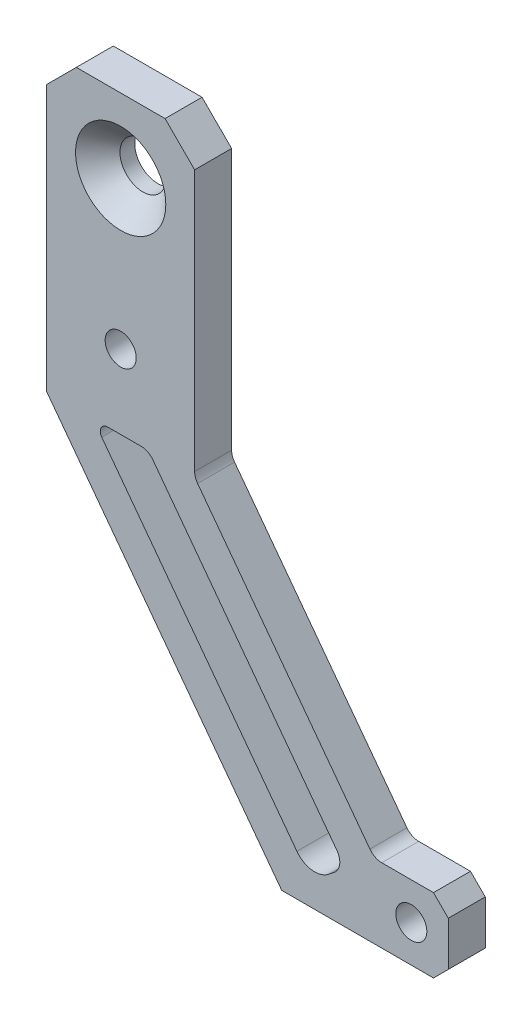
ISO-10303-21;
HEADER;
FILE_DESCRIPTION(('STEP AP214'),'2;1');
FILE_NAME('part.step','',(''),(''),'','','');
FILE_SCHEMA(('AUTOMOTIVE_DESIGN { 1 0 10303 214 1 1 1 1 }'));
ENDSEC;
DATA;
#1=APPLICATION_CONTEXT('core data for automotive mechanical design processes');
#2=APPLICATION_PROTOCOL_DEFINITION('international standard','automotive_design',2000,#1);
#3=PRODUCT_CONTEXT('',#1,'mechanical');
#4=PRODUCT('Part','Part','',(#3));
#5=PRODUCT_RELATED_PRODUCT_CATEGORY('part','',(#4));
#6=PRODUCT_DEFINITION_FORMATION('','',#4);
#7=PRODUCT_DEFINITION_CONTEXT('part definition',#1,'design');
#8=PRODUCT_DEFINITION('design','',#6,#7);
#9=PRODUCT_DEFINITION_SHAPE('','',#8);
#10=(LENGTH_UNIT() NAMED_UNIT(*) SI_UNIT(.MILLI.,.METRE.));
#11=(NAMED_UNIT(*) PLANE_ANGLE_UNIT() SI_UNIT($,.RADIAN.));
#12=(NAMED_UNIT(*) SI_UNIT($,.STERADIAN.) SOLID_ANGLE_UNIT());
#13=UNCERTAINTY_MEASURE_WITH_UNIT(LENGTH_MEASURE(1.E-05),#10,'distance_accuracy_value','');
#14=(GEOMETRIC_REPRESENTATION_CONTEXT(3) GLOBAL_UNCERTAINTY_ASSIGNED_CONTEXT((#13)) GLOBAL_UNIT_ASSIGNED_CONTEXT((#10,
#11,#12)) REPRESENTATION_CONTEXT('',''));
#15=CARTESIAN_POINT('',(0.,0.,0.));
#16=DIRECTION('',(0.,0.,1.));
#17=DIRECTION('',(1.,0.,0.));
#18=AXIS2_PLACEMENT_3D('',#15,#16,#17);
#19=CARTESIAN_POINT('',(0.,0.,2.5));
#20=DIRECTION('',(0.,0.,1.));
#21=DIRECTION('',(1.,0.,0.));
#22=AXIS2_PLACEMENT_3D('',#19,#20,#21);
#23=PLANE('',#22);
#24=CARTESIAN_POINT('',(0.,0.,2.5));
#25=DIRECTION('',(0.,0.,1.));
#26=DIRECTION('',(1.,0.,0.));
#27=AXIS2_PLACEMENT_3D('',#24,#25,#26);
#28=CIRCLE('',#27,6.10000000000002);
#29=CARTESIAN_POINT('',(6.10000000000002,0.,2.5));
#30=VERTEX_POINT('',#29);
#31=EDGE_CURVE('E11',#30,#30,#28,.F.);
#32=ORIENTED_EDGE('',*,*,#31,.T.);
#33=EDGE_LOOP('',(#32));
#34=FACE_BOUND('',#33,.T.);
#35=CARTESIAN_POINT('',(0.,-20.,2.5));
#36=DIRECTION('',(0.,0.,1.));
#37=DIRECTION('',(1.,0.,0.));
#38=AXIS2_PLACEMENT_3D('',#35,#36,#37);
#39=CIRCLE('',#38,2.1);
#40=CARTESIAN_POINT('',(2.1,-20.,2.5));
#41=VERTEX_POINT('',#40);
#42=EDGE_CURVE('E527',#41,#41,#39,.T.);
#43=ORIENTED_EDGE('',*,*,#42,.F.);
#44=EDGE_LOOP('',(#43));
#45=FACE_BOUND('',#44,.T.);
#46=CARTESIAN_POINT('',(39.3,-67.5,2.5));
#47=DIRECTION('',(0.,0.,1.));
#48=DIRECTION('',(1.,0.,0.));
#49=AXIS2_PLACEMENT_3D('',#46,#47,#48);
#50=CIRCLE('',#49,2.1);
#51=CARTESIAN_POINT('',(41.4,-67.5,2.5));
#52=VERTEX_POINT('',#51);
#53=EDGE_CURVE('E230',#52,#52,#50,.T.);
#54=ORIENTED_EDGE('',*,*,#53,.F.);
#55=EDGE_LOOP('',(#54));
#56=FACE_BOUND('',#55,.T.);
#57=DIRECTION('',(1.,0.,0.));
#58=VECTOR('',#57,1.);
#59=CARTESIAN_POINT('',(21.7769230769231,-72.5,2.5));
#60=LINE('',#59,#58);
#61=CARTESIAN_POINT('',(21.7769230769231,-72.5,2.5));
#62=VERTEX_POINT('',#61);
#63=CARTESIAN_POINT('',(42.3,-72.5,2.5));
#64=VERTEX_POINT('',#63);
#65=EDGE_CURVE('E211',#62,#64,#60,.T.);
#66=ORIENTED_EDGE('',*,*,#65,.T.);
#67=DIRECTION('',(-0.707106781186552,-0.707106781186543,0.));
#68=VECTOR('',#67,1.);
#69=CARTESIAN_POINT('',(57.3999999999997,-57.4000000000005,2.5));
#70=LINE('',#69,#68);
#71=CARTESIAN_POINT('',(44.3,-70.5,2.5));
#72=VERTEX_POINT('',#71);
#73=EDGE_CURVE('E326',#64,#72,#70,.F.);
#74=ORIENTED_EDGE('',*,*,#73,.T.);
#75=DIRECTION('',(0.,1.,0.));
#76=VECTOR('',#75,1.);
#77=CARTESIAN_POINT('',(44.3,-72.5,2.5));
#78=LINE('',#77,#76);
#79=CARTESIAN_POINT('',(44.3,-64.5,2.5));
#80=VERTEX_POINT('',#79);
#81=EDGE_CURVE('E213',#72,#80,#78,.T.);
#82=ORIENTED_EDGE('',*,*,#81,.T.);
#83=DIRECTION('',(0.707106781186544,-0.707106781186551,0.));
#84=VECTOR('',#83,1.);
#85=CARTESIAN_POINT('',(-10.0999999999998,-10.0999999999997,2.5));
#86=LINE('',#85,#84);
#87=CARTESIAN_POINT('',(42.3,-62.5,2.5));
#88=VERTEX_POINT('',#87);
#89=EDGE_CURVE('E324',#80,#88,#86,.F.);
#90=ORIENTED_EDGE('',*,*,#89,.T.);
#91=DIRECTION('',(-1.,0.,0.));
#92=VECTOR('',#91,1.);
#93=CARTESIAN_POINT('',(44.3,-62.5,2.5));
#94=LINE('',#93,#92);
#95=CARTESIAN_POINT('',(35.3018488834955,-62.5,2.5));
#96=VERTEX_POINT('',#95);
#97=EDGE_CURVE('E219',#88,#96,#94,.T.);
#98=ORIENTED_EDGE('',*,*,#97,.T.);
#99=CARTESIAN_POINT('',(35.3018488834955,-60.5,2.5));
#100=DIRECTION('',(0.,0.,1.));
#101=DIRECTION('',(1.,0.,0.));
#102=AXIS2_PLACEMENT_3D('',#99,#100,#101);
#103=CIRCLE('',#102,2.);
#104=CARTESIAN_POINT('',(33.7000763613049,-61.6976329935148,2.5));
#105=VERTEX_POINT('',#104);
#106=EDGE_CURVE('E272',#96,#105,#103,.F.);
#107=ORIENTED_EDGE('',*,*,#106,.T.);
#108=DIRECTION('',(-0.598816496757402,0.80088626109529,0.));
#109=VECTOR('',#108,1.);
#110=CARTESIAN_POINT('',(34.3,-62.5,2.5));
#111=LINE('',#110,#109);
#112=CARTESIAN_POINT('',(10.3982274778094,-30.5326087666175,2.5));
#113=VERTEX_POINT('',#112);
#114=EDGE_CURVE('E221',#105,#113,#111,.T.);
#115=ORIENTED_EDGE('',*,*,#114,.T.);
#116=CARTESIAN_POINT('',(12.,-29.3349757731027,2.5));
#117=DIRECTION('',(0.,0.,1.));
#118=DIRECTION('',(1.,0.,0.));
#119=AXIS2_PLACEMENT_3D('',#116,#117,#118);
#120=CIRCLE('',#119,2.);
#121=CARTESIAN_POINT('',(10.,-29.3349757731027,2.5));
#122=VERTEX_POINT('',#121);
#123=EDGE_CURVE('E276',#113,#122,#120,.F.);
#124=ORIENTED_EDGE('',*,*,#123,.T.);
#125=DIRECTION('',(0.,1.,0.));
#126=VECTOR('',#125,1.);
#127=CARTESIAN_POINT('',(10.,-30.,2.5));
#128=LINE('',#127,#126);
#129=CARTESIAN_POINT('',(10.,6.,2.5));
#130=VERTEX_POINT('',#129);
#131=EDGE_CURVE('E224',#122,#130,#128,.T.);
#132=ORIENTED_EDGE('',*,*,#131,.T.);
#133=DIRECTION('',(0.707106781186546,-0.707106781186549,0.));
#134=VECTOR('',#133,1.);
#135=CARTESIAN_POINT('',(8.00000000000002,7.99999999999999,2.5));
#136=LINE('',#135,#134);
#137=CARTESIAN_POINT('',(6.00000000000001,10.,2.5));
#138=VERTEX_POINT('',#137);
#139=EDGE_CURVE('E309',#130,#138,#136,.F.);
#140=ORIENTED_EDGE('',*,*,#139,.T.);
#141=DIRECTION('',(-1.,0.,0.));
#142=VECTOR('',#141,1.);
#143=CARTESIAN_POINT('',(10.,10.,2.5));
#144=LINE('',#143,#142);
#145=CARTESIAN_POINT('',(-6.,10.,2.5));
#146=VERTEX_POINT('',#145);
#147=EDGE_CURVE('E196',#138,#146,#144,.T.);
#148=ORIENTED_EDGE('',*,*,#147,.T.);
#149=DIRECTION('',(0.707106781186549,0.707106781186546,0.));
#150=VECTOR('',#149,1.);
#151=CARTESIAN_POINT('',(-7.99999999999999,8.00000000000002,2.5));
#152=LINE('',#151,#150);
#153=CARTESIAN_POINT('',(-10.,6.00000000000001,2.5));
#154=VERTEX_POINT('',#153);
#155=EDGE_CURVE('E192',#146,#154,#152,.F.);
#156=ORIENTED_EDGE('',*,*,#155,.T.);
#157=DIRECTION('',(0.,-1.,0.));
#158=VECTOR('',#157,1.);
#159=CARTESIAN_POINT('',(-10.,10.,2.5));
#160=LINE('',#159,#158);
#161=CARTESIAN_POINT('',(-9.99999999999999,-30.,2.5));
#162=VERTEX_POINT('',#161);
#163=EDGE_CURVE('E183',#154,#162,#160,.T.);
#164=ORIENTED_EDGE('',*,*,#163,.T.);
#165=DIRECTION('',(0.598816496757402,-0.80088626109529,0.));
#166=VECTOR('',#165,1.);
#167=CARTESIAN_POINT('',(-9.99999999999999,-30.,2.5));
#168=LINE('',#167,#166);
#169=EDGE_CURVE('E188',#162,#62,#168,.T.);
#170=ORIENTED_EDGE('',*,*,#169,.T.);
#171=EDGE_LOOP('',(#66,#74,#82,#90,#98,#107,#115,#124,#132,#140,#148,#156,#164,#170));
#172=FACE_BOUND('',#171,.T.);
#173=DIRECTION('',(0.781430437850523,0.623992364376953,0.));
#174=VECTOR('',#173,1.);
#175=CARTESIAN_POINT('',(25.6860539770931,-69.3784581263998,2.5));
#176=LINE('',#175,#174);
#177=CARTESIAN_POINT('',(28.1061503386972,-67.4459487467406,2.5));
#178=VERTEX_POINT('',#177);
#179=CARTESIAN_POINT('',(28.8769619540967,-66.8304357860407,2.5));
#180=VERTEX_POINT('',#179);
#181=EDGE_CURVE('E465',#178,#180,#176,.T.);
#182=ORIENTED_EDGE('',*,*,#181,.F.);
#183=CARTESIAN_POINT('',(26.2341732455664,-65.101657433189,2.5));
#184=DIRECTION('',(0.,0.,1.));
#185=DIRECTION('',(1.,0.,0.));
#186=AXIS2_PLACEMENT_3D('',#183,#184,#185);
#187=CIRCLE('',#186,3.);
#188=CARTESIAN_POINT('',(23.8315144622805,-66.8981069234612,2.5));
#189=VERTEX_POINT('',#188);
#190=EDGE_CURVE('E294',#178,#189,#187,.F.);
#191=ORIENTED_EDGE('',*,*,#190,.T.);
#192=DIRECTION('',(0.598816496757401,-0.80088626109529,0.));
#193=VECTOR('',#192,1.);
#194=CARTESIAN_POINT('',(-3.75691625279971,-30.,2.5));
#195=LINE('',#194,#193);
#196=CARTESIAN_POINT('',(-2.56149345676264,-31.5988164967574,2.5));
#197=VERTEX_POINT('',#196);
#198=EDGE_CURVE('E454',#197,#189,#195,.T.);
#199=ORIENTED_EDGE('',*,*,#198,.F.);
#200=CARTESIAN_POINT('',(-1.76060719566735,-31.,2.5));
#201=DIRECTION('',(0.,0.,1.));
#202=DIRECTION('',(1.,0.,0.));
#203=AXIS2_PLACEMENT_3D('',#200,#201,#202);
#204=CIRCLE('',#203,1.);
#205=CARTESIAN_POINT('',(-1.76060719566735,-30.,2.5));
#206=VERTEX_POINT('',#205);
#207=EDGE_CURVE('E336',#197,#206,#204,.F.);
#208=ORIENTED_EDGE('',*,*,#207,.T.);
#209=DIRECTION('',(-1.,0.,0.));
#210=VECTOR('',#209,1.);
#211=CARTESIAN_POINT('',(-3.75691625279971,-30.,2.5));
#212=LINE('',#211,#210);
#213=CARTESIAN_POINT('',(2.75506736930424,-30.,2.5));
#214=VERTEX_POINT('',#213);
#215=EDGE_CURVE('E452',#214,#206,#212,.T.);
#216=ORIENTED_EDGE('',*,*,#215,.F.);
#217=CARTESIAN_POINT('',(2.75506736930424,-32.,2.5));
#218=DIRECTION('',(0.,0.,1.));
#219=DIRECTION('',(1.,0.,0.));
#220=AXIS2_PLACEMENT_3D('',#217,#218,#219);
#221=CIRCLE('',#220,2.);
#222=CARTESIAN_POINT('',(4.35683989149483,-30.8023670064852,2.5));
#223=VERTEX_POINT('',#222);
#224=EDGE_CURVE('E280',#214,#223,#221,.F.);
#225=ORIENTED_EDGE('',*,*,#224,.T.);
#226=DIRECTION('',(-0.598816496757401,0.80088626109529,0.));
#227=VECTOR('',#226,1.);
#228=CARTESIAN_POINT('',(30.39086909983,-65.6215418736001,2.5));
#229=LINE('',#228,#227);
#230=CARTESIAN_POINT('',(29.2307497475334,-64.0699419168248,2.5));
#231=VERTEX_POINT('',#230);
#232=EDGE_CURVE('E459',#231,#223,#229,.T.);
#233=ORIENTED_EDGE('',*,*,#232,.F.);
#234=CARTESIAN_POINT('',(27.6289772253428,-65.2675749103396,2.5));
#235=DIRECTION('',(0.,0.,1.));
#236=DIRECTION('',(1.,0.,0.));
#237=AXIS2_PLACEMENT_3D('',#234,#235,#236);
#238=CIRCLE('',#237,2.);
#239=EDGE_CURVE('E284',#231,#180,#238,.F.);
#240=ORIENTED_EDGE('',*,*,#239,.T.);
#241=EDGE_LOOP('',(#182,#191,#199,#208,#216,#225,#233,#240));
#242=FACE_BOUND('',#241,.T.);
#243=ADVANCED_FACE('F34',(#34,#45,#56,#172,#242),#23,.T.);
#244=CARTESIAN_POINT('',(0.,0.,-2.5));
#245=DIRECTION('',(0.,0.,1.));
#246=DIRECTION('',(1.,0.,0.));
#247=AXIS2_PLACEMENT_3D('',#244,#245,#246);
#248=PLANE('',#247);
#249=CARTESIAN_POINT('',(0.,-20.,-2.5));
#250=DIRECTION('',(0.,0.,1.));
#251=DIRECTION('',(1.,0.,0.));
#252=AXIS2_PLACEMENT_3D('',#249,#250,#251);
#253=CIRCLE('',#252,2.1);
#254=CARTESIAN_POINT('',(2.1,-20.,-2.5));
#255=VERTEX_POINT('',#254);
#256=EDGE_CURVE('E472',#255,#255,#253,.T.);
#257=ORIENTED_EDGE('',*,*,#256,.T.);
#258=EDGE_LOOP('',(#257));
#259=FACE_BOUND('',#258,.T.);
#260=CARTESIAN_POINT('',(0.,0.,-2.5));
#261=DIRECTION('',(0.,0.,1.));
#262=DIRECTION('',(1.,0.,0.));
#263=AXIS2_PLACEMENT_3D('',#260,#261,#262);
#264=CIRCLE('',#263,3.1);
#265=CARTESIAN_POINT('',(3.1,0.,-2.5));
#266=VERTEX_POINT('',#265);
#267=EDGE_CURVE('E458',#266,#266,#264,.T.);
#268=ORIENTED_EDGE('',*,*,#267,.T.);
#269=EDGE_LOOP('',(#268));
#270=FACE_BOUND('',#269,.T.);
#271=CARTESIAN_POINT('',(39.3,-67.5,-2.5));
#272=DIRECTION('',(0.,0.,1.));
#273=DIRECTION('',(1.,0.,0.));
#274=AXIS2_PLACEMENT_3D('',#271,#272,#273);
#275=CIRCLE('',#274,2.1);
#276=CARTESIAN_POINT('',(41.4,-67.5,-2.5));
#277=VERTEX_POINT('',#276);
#278=EDGE_CURVE('E462',#277,#277,#275,.T.);
#279=ORIENTED_EDGE('',*,*,#278,.T.);
#280=EDGE_LOOP('',(#279));
#281=FACE_BOUND('',#280,.T.);
#282=DIRECTION('',(0.,1.,0.));
#283=VECTOR('',#282,1.);
#284=CARTESIAN_POINT('',(44.3,-72.5,-2.5));
#285=LINE('',#284,#283);
#286=CARTESIAN_POINT('',(44.3,-70.5,-2.5));
#287=VERTEX_POINT('',#286);
#288=CARTESIAN_POINT('',(44.3,-64.5,-2.5));
#289=VERTEX_POINT('',#288);
#290=EDGE_CURVE('E237',#287,#289,#285,.T.);
#291=ORIENTED_EDGE('',*,*,#290,.F.);
#292=DIRECTION('',(0.707106781186552,0.707106781186543,0.));
#293=VECTOR('',#292,1.);
#294=CARTESIAN_POINT('',(44.3,-70.5,-2.5));
#295=LINE('',#294,#293);
#296=CARTESIAN_POINT('',(42.3,-72.5,-2.5));
#297=VERTEX_POINT('',#296);
#298=EDGE_CURVE('E320',#287,#297,#295,.F.);
#299=ORIENTED_EDGE('',*,*,#298,.T.);
#300=DIRECTION('',(1.,0.,0.));
#301=VECTOR('',#300,1.);
#302=CARTESIAN_POINT('',(21.7769230769231,-72.5,-2.5));
#303=LINE('',#302,#301);
#304=CARTESIAN_POINT('',(21.7769230769231,-72.5,-2.5));
#305=VERTEX_POINT('',#304);
#306=EDGE_CURVE('E234',#305,#297,#303,.T.);
#307=ORIENTED_EDGE('',*,*,#306,.F.);
#308=DIRECTION('',(0.598816496757402,-0.80088626109529,0.));
#309=VECTOR('',#308,1.);
#310=CARTESIAN_POINT('',(-9.99999999999999,-30.,-2.5));
#311=LINE('',#310,#309);
#312=CARTESIAN_POINT('',(-9.99999999999999,-30.,-2.5));
#313=VERTEX_POINT('',#312);
#314=EDGE_CURVE('E232',#313,#305,#311,.T.);
#315=ORIENTED_EDGE('',*,*,#314,.F.);
#316=DIRECTION('',(0.,-1.,0.));
#317=VECTOR('',#316,1.);
#318=CARTESIAN_POINT('',(-10.,10.,-2.5));
#319=LINE('',#318,#317);
#320=CARTESIAN_POINT('',(-10.,6.00000000000001,-2.5));
#321=VERTEX_POINT('',#320);
#322=EDGE_CURVE('E202',#321,#313,#319,.T.);
#323=ORIENTED_EDGE('',*,*,#322,.F.);
#324=DIRECTION('',(-0.707106781186549,-0.707106781186546,0.));
#325=VECTOR('',#324,1.);
#326=CARTESIAN_POINT('',(-10.,6.00000000000001,-2.5));
#327=LINE('',#326,#325);
#328=CARTESIAN_POINT('',(-6.,10.,-2.5));
#329=VERTEX_POINT('',#328);
#330=EDGE_CURVE('E302',#321,#329,#327,.F.);
#331=ORIENTED_EDGE('',*,*,#330,.T.);
#332=DIRECTION('',(-1.,0.,0.));
#333=VECTOR('',#332,1.);
#334=CARTESIAN_POINT('',(10.,10.,-2.5));
#335=LINE('',#334,#333);
#336=CARTESIAN_POINT('',(6.00000000000001,10.,-2.5));
#337=VERTEX_POINT('',#336);
#338=EDGE_CURVE('E227',#337,#329,#335,.T.);
#339=ORIENTED_EDGE('',*,*,#338,.F.);
#340=DIRECTION('',(-0.707106781186546,0.707106781186549,0.));
#341=VECTOR('',#340,1.);
#342=CARTESIAN_POINT('',(6.00000000000001,10.,-2.5));
#343=LINE('',#342,#341);
#344=CARTESIAN_POINT('',(10.,6.,-2.5));
#345=VERTEX_POINT('',#344);
#346=EDGE_CURVE('E304',#337,#345,#343,.F.);
#347=ORIENTED_EDGE('',*,*,#346,.T.);
#348=DIRECTION('',(0.,1.,0.));
#349=VECTOR('',#348,1.);
#350=CARTESIAN_POINT('',(10.,-30.,-2.5));
#351=LINE('',#350,#349);
#352=CARTESIAN_POINT('',(10.,-29.3349757731027,-2.5));
#353=VERTEX_POINT('',#352);
#354=EDGE_CURVE('E245',#353,#345,#351,.T.);
#355=ORIENTED_EDGE('',*,*,#354,.F.);
#356=CARTESIAN_POINT('',(12.,-29.3349757731027,-2.5));
#357=DIRECTION('',(0.,0.,1.));
#358=DIRECTION('',(1.,0.,0.));
#359=AXIS2_PLACEMENT_3D('',#356,#357,#358);
#360=CIRCLE('',#359,2.);
#361=CARTESIAN_POINT('',(10.3982274778094,-30.5326087666175,-2.5));
#362=VERTEX_POINT('',#361);
#363=EDGE_CURVE('E274',#353,#362,#360,.T.);
#364=ORIENTED_EDGE('',*,*,#363,.T.);
#365=DIRECTION('',(-0.598816496757402,0.80088626109529,0.));
#366=VECTOR('',#365,1.);
#367=CARTESIAN_POINT('',(34.3,-62.5,-2.5));
#368=LINE('',#367,#366);
#369=CARTESIAN_POINT('',(33.7000763613049,-61.6976329935148,-2.5));
#370=VERTEX_POINT('',#369);
#371=EDGE_CURVE('E242',#370,#362,#368,.T.);
#372=ORIENTED_EDGE('',*,*,#371,.F.);
#373=CARTESIAN_POINT('',(35.3018488834955,-60.5,-2.5));
#374=DIRECTION('',(0.,0.,1.));
#375=DIRECTION('',(1.,0.,0.));
#376=AXIS2_PLACEMENT_3D('',#373,#374,#375);
#377=CIRCLE('',#376,2.);
#378=CARTESIAN_POINT('',(35.3018488834955,-62.5,-2.5));
#379=VERTEX_POINT('',#378);
#380=EDGE_CURVE('E269',#370,#379,#377,.T.);
#381=ORIENTED_EDGE('',*,*,#380,.T.);
#382=DIRECTION('',(-1.,0.,0.));
#383=VECTOR('',#382,1.);
#384=CARTESIAN_POINT('',(44.3,-62.5,-2.5));
#385=LINE('',#384,#383);
#386=CARTESIAN_POINT('',(42.3,-62.5,-2.5));
#387=VERTEX_POINT('',#386);
#388=EDGE_CURVE('E240',#387,#379,#385,.T.);
#389=ORIENTED_EDGE('',*,*,#388,.F.);
#390=DIRECTION('',(-0.707106781186544,0.707106781186551,0.));
#391=VECTOR('',#390,1.);
#392=CARTESIAN_POINT('',(42.3,-62.5,-2.5));
#393=LINE('',#392,#391);
#394=EDGE_CURVE('E318',#387,#289,#393,.F.);
#395=ORIENTED_EDGE('',*,*,#394,.T.);
#396=EDGE_LOOP('',(#291,#299,#307,#315,#323,#331,#339,#347,#355,#364,#372,#381,#389,#395));
#397=FACE_BOUND('',#396,.T.);
#398=DIRECTION('',(-1.,0.,0.));
#399=VECTOR('',#398,1.);
#400=CARTESIAN_POINT('',(-3.75691625279971,-30.,-2.5));
#401=LINE('',#400,#399);
#402=CARTESIAN_POINT('',(2.75506736930424,-30.,-2.5));
#403=VERTEX_POINT('',#402);
#404=CARTESIAN_POINT('',(-1.76060719566735,-30.,-2.5));
#405=VERTEX_POINT('',#404);
#406=EDGE_CURVE('E477',#403,#405,#401,.T.);
#407=ORIENTED_EDGE('',*,*,#406,.T.);
#408=CARTESIAN_POINT('',(-1.76060719566735,-31.,-2.5));
#409=DIRECTION('',(0.,0.,1.));
#410=DIRECTION('',(1.,0.,0.));
#411=AXIS2_PLACEMENT_3D('',#408,#409,#410);
#412=CIRCLE('',#411,1.);
#413=CARTESIAN_POINT('',(-2.56149345676264,-31.5988164967574,-2.5));
#414=VERTEX_POINT('',#413);
#415=EDGE_CURVE('E50',#405,#414,#412,.T.);
#416=ORIENTED_EDGE('',*,*,#415,.T.);
#417=DIRECTION('',(0.598816496757401,-0.80088626109529,0.));
#418=VECTOR('',#417,1.);
#419=CARTESIAN_POINT('',(-3.75691625279971,-30.,-2.5));
#420=LINE('',#419,#418);
#421=CARTESIAN_POINT('',(23.8315144622805,-66.8981069234612,-2.5));
#422=VERTEX_POINT('',#421);
#423=EDGE_CURVE('E469',#414,#422,#420,.T.);
#424=ORIENTED_EDGE('',*,*,#423,.T.);
#425=CARTESIAN_POINT('',(26.2341732455664,-65.101657433189,-2.5));
#426=DIRECTION('',(0.,0.,1.));
#427=DIRECTION('',(1.,0.,0.));
#428=AXIS2_PLACEMENT_3D('',#425,#426,#427);
#429=CIRCLE('',#428,3.);
#430=CARTESIAN_POINT('',(28.1061503386972,-67.4459487467406,-2.5));
#431=VERTEX_POINT('',#430);
#432=EDGE_CURVE('E292',#422,#431,#429,.T.);
#433=ORIENTED_EDGE('',*,*,#432,.T.);
#434=DIRECTION('',(0.781430437850523,0.623992364376953,0.));
#435=VECTOR('',#434,1.);
#436=CARTESIAN_POINT('',(25.6860539770931,-69.3784581263998,-2.5));
#437=LINE('',#436,#435);
#438=CARTESIAN_POINT('',(28.8769619540967,-66.8304357860407,-2.5));
#439=VERTEX_POINT('',#438);
#440=EDGE_CURVE('E471',#431,#439,#437,.T.);
#441=ORIENTED_EDGE('',*,*,#440,.T.);
#442=CARTESIAN_POINT('',(27.6289772253428,-65.2675749103396,-2.5));
#443=DIRECTION('',(0.,0.,1.));
#444=DIRECTION('',(1.,0.,0.));
#445=AXIS2_PLACEMENT_3D('',#442,#443,#444);
#446=CIRCLE('',#445,2.);
#447=CARTESIAN_POINT('',(29.2307497475334,-64.0699419168248,-2.5));
#448=VERTEX_POINT('',#447);
#449=EDGE_CURVE('E282',#439,#448,#446,.T.);
#450=ORIENTED_EDGE('',*,*,#449,.T.);
#451=DIRECTION('',(-0.598816496757401,0.80088626109529,0.));
#452=VECTOR('',#451,1.);
#453=CARTESIAN_POINT('',(30.39086909983,-65.6215418736001,-2.5));
#454=LINE('',#453,#452);
#455=CARTESIAN_POINT('',(4.35683989149483,-30.8023670064852,-2.5));
#456=VERTEX_POINT('',#455);
#457=EDGE_CURVE('E474',#448,#456,#454,.T.);
#458=ORIENTED_EDGE('',*,*,#457,.T.);
#459=CARTESIAN_POINT('',(2.75506736930424,-32.,-2.5));
#460=DIRECTION('',(0.,0.,1.));
#461=DIRECTION('',(1.,0.,0.));
#462=AXIS2_PLACEMENT_3D('',#459,#460,#461);
#463=CIRCLE('',#462,2.);
#464=EDGE_CURVE('E278',#456,#403,#463,.T.);
#465=ORIENTED_EDGE('',*,*,#464,.T.);
#466=EDGE_LOOP('',(#407,#416,#424,#433,#441,#450,#458,#465));
#467=FACE_BOUND('',#466,.T.);
#468=ADVANCED_FACE('F354',(#259,#270,#281,#397,#467),#248,.F.);
#469=CARTESIAN_POINT('',(10.,10.,2.5));
#470=DIRECTION('',(0.,-1.,0.));
#471=DIRECTION('',(1.,0.,0.));
#472=AXIS2_PLACEMENT_3D('',#469,#470,#471);
#473=PLANE('',#472);
#474=ORIENTED_EDGE('',*,*,#147,.F.);
#475=DIRECTION('',(0.,0.,-1.));
#476=VECTOR('',#475,1.);
#477=CARTESIAN_POINT('',(6.00000000000001,10.,2.5));
#478=LINE('',#477,#476);
#479=EDGE_CURVE('E299',#138,#337,#478,.T.);
#480=ORIENTED_EDGE('',*,*,#479,.T.);
#481=ORIENTED_EDGE('',*,*,#338,.T.);
#482=DIRECTION('',(0.,0.,1.));
#483=VECTOR('',#482,1.);
#484=CARTESIAN_POINT('',(-6.,10.,2.5));
#485=LINE('',#484,#483);
#486=EDGE_CURVE('E297',#329,#146,#485,.T.);
#487=ORIENTED_EDGE('',*,*,#486,.T.);
#488=EDGE_LOOP('',(#474,#480,#481,#487));
#489=FACE_BOUND('',#488,.T.);
#490=ADVANCED_FACE('F360',(#489),#473,.F.);
#491=CARTESIAN_POINT('',(-10.,10.,2.5));
#492=DIRECTION('',(1.,0.,0.));
#493=DIRECTION('',(0.,1.,0.));
#494=AXIS2_PLACEMENT_3D('',#491,#492,#493);
#495=PLANE('',#494);
#496=ORIENTED_EDGE('',*,*,#163,.F.);
#497=DIRECTION('',(0.,0.,-1.));
#498=VECTOR('',#497,1.);
#499=CARTESIAN_POINT('',(-10.,6.00000000000001,2.5));
#500=LINE('',#499,#498);
#501=EDGE_CURVE('E311',#154,#321,#500,.T.);
#502=ORIENTED_EDGE('',*,*,#501,.T.);
#503=ORIENTED_EDGE('',*,*,#322,.T.);
#504=DIRECTION('',(0.,0.,-1.));
#505=VECTOR('',#504,1.);
#506=CARTESIAN_POINT('',(-9.99999999999999,-30.,2.5));
#507=LINE('',#506,#505);
#508=EDGE_CURVE('E199',#162,#313,#507,.T.);
#509=ORIENTED_EDGE('',*,*,#508,.F.);
#510=EDGE_LOOP('',(#496,#502,#503,#509));
#511=FACE_BOUND('',#510,.T.);
#512=ADVANCED_FACE('F200',(#511),#495,.F.);
#513=CARTESIAN_POINT('',(-9.99999999999999,-30.,2.5));
#514=DIRECTION('',(0.80088626109529,0.598816496757402,0.));
#515=DIRECTION('',(-0.598816496757402,0.80088626109529,0.));
#516=AXIS2_PLACEMENT_3D('',#513,#514,#515);
#517=PLANE('',#516);
#518=ORIENTED_EDGE('',*,*,#314,.T.);
#519=DIRECTION('',(0.,0.,-1.));
#520=VECTOR('',#519,1.);
#521=CARTESIAN_POINT('',(21.7769230769231,-72.5,2.5));
#522=LINE('',#521,#520);
#523=EDGE_CURVE('E206',#62,#305,#522,.T.);
#524=ORIENTED_EDGE('',*,*,#523,.F.);
#525=ORIENTED_EDGE('',*,*,#169,.F.);
#526=ORIENTED_EDGE('',*,*,#508,.T.);
#527=EDGE_LOOP('',(#518,#524,#525,#526));
#528=FACE_BOUND('',#527,.T.);
#529=ADVANCED_FACE('F208',(#528),#517,.F.);
#530=CARTESIAN_POINT('',(21.7769230769231,-72.5,2.5));
#531=DIRECTION('',(0.,1.,0.));
#532=DIRECTION('',(0.,0.,1.));
#533=AXIS2_PLACEMENT_3D('',#530,#531,#532);
#534=PLANE('',#533);
#535=ORIENTED_EDGE('',*,*,#306,.T.);
#536=DIRECTION('',(0.,0.,1.));
#537=VECTOR('',#536,1.);
#538=CARTESIAN_POINT('',(42.3,-72.5,2.5));
#539=LINE('',#538,#537);
#540=EDGE_CURVE('E322',#297,#64,#539,.T.);
#541=ORIENTED_EDGE('',*,*,#540,.T.);
#542=ORIENTED_EDGE('',*,*,#65,.F.);
#543=ORIENTED_EDGE('',*,*,#523,.T.);
#544=EDGE_LOOP('',(#535,#541,#542,#543));
#545=FACE_BOUND('',#544,.T.);
#546=ADVANCED_FACE('F383',(#545),#534,.F.);
#547=CARTESIAN_POINT('',(44.3,-72.5,2.5));
#548=DIRECTION('',(-1.,0.,0.));
#549=DIRECTION('',(0.,-1.,0.));
#550=AXIS2_PLACEMENT_3D('',#547,#548,#549);
#551=PLANE('',#550);
#552=ORIENTED_EDGE('',*,*,#81,.F.);
#553=DIRECTION('',(0.,0.,-1.));
#554=VECTOR('',#553,1.);
#555=CARTESIAN_POINT('',(44.3,-70.5,2.5));
#556=LINE('',#555,#554);
#557=EDGE_CURVE('E315',#72,#287,#556,.T.);
#558=ORIENTED_EDGE('',*,*,#557,.T.);
#559=ORIENTED_EDGE('',*,*,#290,.T.);
#560=DIRECTION('',(0.,0.,1.));
#561=VECTOR('',#560,1.);
#562=CARTESIAN_POINT('',(44.3,-64.5,2.5));
#563=LINE('',#562,#561);
#564=EDGE_CURVE('E313',#289,#80,#563,.T.);
#565=ORIENTED_EDGE('',*,*,#564,.T.);
#566=EDGE_LOOP('',(#552,#558,#559,#565));
#567=FACE_BOUND('',#566,.T.);
#568=ADVANCED_FACE('F379',(#567),#551,.F.);
#569=CARTESIAN_POINT('',(44.3,-62.5,2.5));
#570=DIRECTION('',(0.,-1.,0.));
#571=DIRECTION('',(1.,0.,0.));
#572=AXIS2_PLACEMENT_3D('',#569,#570,#571);
#573=PLANE('',#572);
#574=ORIENTED_EDGE('',*,*,#97,.F.);
#575=DIRECTION('',(0.,0.,-1.));
#576=VECTOR('',#575,1.);
#577=CARTESIAN_POINT('',(42.3,-62.5,2.5));
#578=LINE('',#577,#576);
#579=EDGE_CURVE('E328',#88,#387,#578,.T.);
#580=ORIENTED_EDGE('',*,*,#579,.T.);
#581=ORIENTED_EDGE('',*,*,#388,.T.);
#582=DIRECTION('',(0.,0.,-1.));
#583=VECTOR('',#582,1.);
#584=CARTESIAN_POINT('',(35.3018488834955,-62.5,2.5));
#585=LINE('',#584,#583);
#586=EDGE_CURVE('E253',#379,#96,#585,.F.);
#587=ORIENTED_EDGE('',*,*,#586,.T.);
#588=EDGE_LOOP('',(#574,#580,#581,#587));
#589=FACE_BOUND('',#588,.T.);
#590=ADVANCED_FACE('F375',(#589),#573,.F.);
#591=CARTESIAN_POINT('',(34.3,-62.5,2.5));
#592=DIRECTION('',(-0.80088626109529,-0.598816496757402,0.));
#593=DIRECTION('',(0.598816496757402,-0.80088626109529,0.));
#594=AXIS2_PLACEMENT_3D('',#591,#592,#593);
#595=PLANE('',#594);
#596=ORIENTED_EDGE('',*,*,#114,.F.);
#597=DIRECTION('',(0.,0.,-1.));
#598=VECTOR('',#597,1.);
#599=CARTESIAN_POINT('',(33.7000763613049,-61.6976329935148,-2.5));
#600=LINE('',#599,#598);
#601=EDGE_CURVE('E250',#105,#370,#600,.T.);
#602=ORIENTED_EDGE('',*,*,#601,.T.);
#603=ORIENTED_EDGE('',*,*,#371,.T.);
#604=DIRECTION('',(0.,0.,-1.));
#605=VECTOR('',#604,1.);
#606=CARTESIAN_POINT('',(10.3982274778094,-30.5326087666175,2.5));
#607=LINE('',#606,#605);
#608=EDGE_CURVE('E205',#362,#113,#607,.F.);
#609=ORIENTED_EDGE('',*,*,#608,.T.);
#610=EDGE_LOOP('',(#596,#602,#603,#609));
#611=FACE_BOUND('',#610,.T.);
#612=ADVANCED_FACE('F371',(#611),#595,.F.);
#613=CARTESIAN_POINT('',(10.,-30.,2.5));
#614=DIRECTION('',(-1.,0.,0.));
#615=DIRECTION('',(0.,-1.,0.));
#616=AXIS2_PLACEMENT_3D('',#613,#614,#615);
#617=PLANE('',#616);
#618=ORIENTED_EDGE('',*,*,#354,.T.);
#619=DIRECTION('',(0.,0.,1.));
#620=VECTOR('',#619,1.);
#621=CARTESIAN_POINT('',(10.,6.,2.5));
#622=LINE('',#621,#620);
#623=EDGE_CURVE('E306',#345,#130,#622,.T.);
#624=ORIENTED_EDGE('',*,*,#623,.T.);
#625=ORIENTED_EDGE('',*,*,#131,.F.);
#626=DIRECTION('',(0.,0.,-1.));
#627=VECTOR('',#626,1.);
#628=CARTESIAN_POINT('',(10.,-29.3349757731027,-2.5));
#629=LINE('',#628,#627);
#630=EDGE_CURVE('E256',#122,#353,#629,.T.);
#631=ORIENTED_EDGE('',*,*,#630,.T.);
#632=EDGE_LOOP('',(#618,#624,#625,#631));
#633=FACE_BOUND('',#632,.T.);
#634=ADVANCED_FACE('F368',(#633),#617,.F.);
#635=CARTESIAN_POINT('',(39.3,-67.5,2.5));
#636=DIRECTION('',(0.,0.,-1.));
#637=DIRECTION('',(-1.,0.,0.));
#638=AXIS2_PLACEMENT_3D('',#635,#636,#637);
#639=CYLINDRICAL_SURFACE('',#638,2.1);
#640=ORIENTED_EDGE('',*,*,#53,.T.);
#641=EDGE_LOOP('',(#640));
#642=FACE_BOUND('',#641,.T.);
#643=ORIENTED_EDGE('',*,*,#278,.F.);
#644=EDGE_LOOP('',(#643));
#645=FACE_BOUND('',#644,.T.);
#646=ADVANCED_FACE('F365',(#642,#645),#639,.F.);
#647=CARTESIAN_POINT('',(0.,0.,2.5));
#648=DIRECTION('',(0.,0.,-1.));
#649=DIRECTION('',(-1.,0.,0.));
#650=AXIS2_PLACEMENT_3D('',#647,#648,#649);
#651=CYLINDRICAL_SURFACE('',#650,3.1);
#652=CARTESIAN_POINT('',(0.,0.,-0.500000000000006));
#653=DIRECTION('',(0.,0.,1.));
#654=DIRECTION('',(1.,0.,0.));
#655=AXIS2_PLACEMENT_3D('',#652,#653,#654);
#656=CIRCLE('',#655,3.1);
#657=CARTESIAN_POINT('',(3.1,0.,-0.500000000000006));
#658=VERTEX_POINT('',#657);
#659=EDGE_CURVE('E43',#658,#658,#656,.T.);
#660=ORIENTED_EDGE('',*,*,#659,.T.);
#661=EDGE_LOOP('',(#660));
#662=FACE_BOUND('',#661,.T.);
#663=ORIENTED_EDGE('',*,*,#267,.F.);
#664=EDGE_LOOP('',(#663));
#665=FACE_BOUND('',#664,.T.);
#666=ADVANCED_FACE('F340',(#662,#665),#651,.F.);
#667=CARTESIAN_POINT('',(-3.75691625279971,-30.,2.5));
#668=DIRECTION('',(0.80088626109529,0.598816496757401,0.));
#669=DIRECTION('',(-0.598816496757401,0.80088626109529,0.));
#670=AXIS2_PLACEMENT_3D('',#667,#668,#669);
#671=PLANE('',#670);
#672=ORIENTED_EDGE('',*,*,#423,.F.);
#673=DIRECTION('',(0.,0.,-1.));
#674=VECTOR('',#673,1.);
#675=CARTESIAN_POINT('',(-2.56149345676264,-31.5988164967574,2.5));
#676=LINE('',#675,#674);
#677=EDGE_CURVE('E57',#414,#197,#676,.F.);
#678=ORIENTED_EDGE('',*,*,#677,.T.);
#679=ORIENTED_EDGE('',*,*,#198,.T.);
#680=DIRECTION('',(0.,0.,-1.));
#681=VECTOR('',#680,1.);
#682=CARTESIAN_POINT('',(23.8315144622805,-66.8981069234612,-2.5));
#683=LINE('',#682,#681);
#684=EDGE_CURVE('E287',#189,#422,#683,.T.);
#685=ORIENTED_EDGE('',*,*,#684,.T.);
#686=EDGE_LOOP('',(#672,#678,#679,#685));
#687=FACE_BOUND('',#686,.T.);
#688=ADVANCED_FACE('F524',(#687),#671,.T.);
#689=CARTESIAN_POINT('',(25.6860539770931,-69.3784581263998,2.5));
#690=DIRECTION('',(-0.623992364376953,0.781430437850523,0.));
#691=DIRECTION('',(-0.781430437850523,-0.623992364376953,0.));
#692=AXIS2_PLACEMENT_3D('',#689,#690,#691);
#693=PLANE('',#692);
#694=ORIENTED_EDGE('',*,*,#440,.F.);
#695=DIRECTION('',(0.,0.,-1.));
#696=VECTOR('',#695,1.);
#697=CARTESIAN_POINT('',(28.1061503386972,-67.4459487467406,2.5));
#698=LINE('',#697,#696);
#699=EDGE_CURVE('E290',#431,#178,#698,.F.);
#700=ORIENTED_EDGE('',*,*,#699,.T.);
#701=ORIENTED_EDGE('',*,*,#181,.T.);
#702=DIRECTION('',(0.,0.,-1.));
#703=VECTOR('',#702,1.);
#704=CARTESIAN_POINT('',(28.8769619540967,-66.8304357860407,-2.5));
#705=LINE('',#704,#703);
#706=EDGE_CURVE('E266',#180,#439,#705,.T.);
#707=ORIENTED_EDGE('',*,*,#706,.T.);
#708=EDGE_LOOP('',(#694,#700,#701,#707));
#709=FACE_BOUND('',#708,.T.);
#710=ADVANCED_FACE('F548',(#709),#693,.T.);
#711=CARTESIAN_POINT('',(30.39086909983,-65.6215418736001,2.5));
#712=DIRECTION('',(-0.80088626109529,-0.598816496757401,0.));
#713=DIRECTION('',(0.598816496757402,-0.80088626109529,0.));
#714=AXIS2_PLACEMENT_3D('',#711,#712,#713);
#715=PLANE('',#714);
#716=ORIENTED_EDGE('',*,*,#232,.T.);
#717=DIRECTION('',(0.,0.,-1.));
#718=VECTOR('',#717,1.);
#719=CARTESIAN_POINT('',(4.35683989149482,-30.8023670064852,-2.5));
#720=LINE('',#719,#718);
#721=EDGE_CURVE('E261',#223,#456,#720,.T.);
#722=ORIENTED_EDGE('',*,*,#721,.T.);
#723=ORIENTED_EDGE('',*,*,#457,.F.);
#724=DIRECTION('',(0.,0.,-1.));
#725=VECTOR('',#724,1.);
#726=CARTESIAN_POINT('',(29.2307497475334,-64.0699419168248,2.5));
#727=LINE('',#726,#725);
#728=EDGE_CURVE('E259',#448,#231,#727,.F.);
#729=ORIENTED_EDGE('',*,*,#728,.T.);
#730=EDGE_LOOP('',(#716,#722,#723,#729));
#731=FACE_BOUND('',#730,.T.);
#732=ADVANCED_FACE('F514',(#731),#715,.T.);
#733=CARTESIAN_POINT('',(-3.75691625279971,-30.,2.5));
#734=DIRECTION('',(0.,-1.,0.));
#735=DIRECTION('',(0.,0.,-1.));
#736=AXIS2_PLACEMENT_3D('',#733,#734,#735);
#737=PLANE('',#736);
#738=ORIENTED_EDGE('',*,*,#215,.T.);
#739=DIRECTION('',(0.,0.,-1.));
#740=VECTOR('',#739,1.);
#741=CARTESIAN_POINT('',(-1.76060719566735,-30.,-2.5));
#742=LINE('',#741,#740);
#743=EDGE_CURVE('E331',#206,#405,#742,.T.);
#744=ORIENTED_EDGE('',*,*,#743,.T.);
#745=ORIENTED_EDGE('',*,*,#406,.F.);
#746=DIRECTION('',(0.,0.,-1.));
#747=VECTOR('',#746,1.);
#748=CARTESIAN_POINT('',(2.75506736930424,-30.,2.5));
#749=LINE('',#748,#747);
#750=EDGE_CURVE('E264',#403,#214,#749,.F.);
#751=ORIENTED_EDGE('',*,*,#750,.T.);
#752=EDGE_LOOP('',(#738,#744,#745,#751));
#753=FACE_BOUND('',#752,.T.);
#754=ADVANCED_FACE('F399',(#753),#737,.T.);
#755=CARTESIAN_POINT('',(35.3018488834955,-60.5,2.5));
#756=DIRECTION('',(0.,0.,1.));
#757=DIRECTION('',(1.,0.,0.));
#758=AXIS2_PLACEMENT_3D('',#755,#756,#757);
#759=CYLINDRICAL_SURFACE('',#758,2.);
#760=ORIENTED_EDGE('',*,*,#106,.F.);
#761=ORIENTED_EDGE('',*,*,#586,.F.);
#762=ORIENTED_EDGE('',*,*,#380,.F.);
#763=ORIENTED_EDGE('',*,*,#601,.F.);
#764=EDGE_LOOP('',(#760,#761,#762,#763));
#765=FACE_BOUND('',#764,.T.);
#766=ADVANCED_FACE('F395',(#765),#759,.F.);
#767=CARTESIAN_POINT('',(12.,-29.3349757731027,2.5));
#768=DIRECTION('',(0.,0.,1.));
#769=DIRECTION('',(1.,0.,0.));
#770=AXIS2_PLACEMENT_3D('',#767,#768,#769);
#771=CYLINDRICAL_SURFACE('',#770,2.);
#772=ORIENTED_EDGE('',*,*,#123,.F.);
#773=ORIENTED_EDGE('',*,*,#608,.F.);
#774=ORIENTED_EDGE('',*,*,#363,.F.);
#775=ORIENTED_EDGE('',*,*,#630,.F.);
#776=EDGE_LOOP('',(#772,#773,#774,#775));
#777=FACE_BOUND('',#776,.T.);
#778=ADVANCED_FACE('F398',(#777),#771,.F.);
#779=CARTESIAN_POINT('',(2.75506736930424,-32.,2.5));
#780=DIRECTION('',(0.,0.,1.));
#781=DIRECTION('',(1.,0.,0.));
#782=AXIS2_PLACEMENT_3D('',#779,#780,#781);
#783=CYLINDRICAL_SURFACE('',#782,2.);
#784=ORIENTED_EDGE('',*,*,#224,.F.);
#785=ORIENTED_EDGE('',*,*,#750,.F.);
#786=ORIENTED_EDGE('',*,*,#464,.F.);
#787=ORIENTED_EDGE('',*,*,#721,.F.);
#788=EDGE_LOOP('',(#784,#785,#786,#787));
#789=FACE_BOUND('',#788,.T.);
#790=ADVANCED_FACE('F403',(#789),#783,.F.);
#791=CARTESIAN_POINT('',(27.6289772253428,-65.2675749103396,2.5));
#792=DIRECTION('',(0.,0.,1.));
#793=DIRECTION('',(1.,0.,0.));
#794=AXIS2_PLACEMENT_3D('',#791,#792,#793);
#795=CYLINDRICAL_SURFACE('',#794,2.);
#796=ORIENTED_EDGE('',*,*,#239,.F.);
#797=ORIENTED_EDGE('',*,*,#728,.F.);
#798=ORIENTED_EDGE('',*,*,#449,.F.);
#799=ORIENTED_EDGE('',*,*,#706,.F.);
#800=EDGE_LOOP('',(#796,#797,#798,#799));
#801=FACE_BOUND('',#800,.T.);
#802=ADVANCED_FACE('F407',(#801),#795,.F.);
#803=CARTESIAN_POINT('',(26.2341732455664,-65.101657433189,2.5));
#804=DIRECTION('',(0.,0.,1.));
#805=DIRECTION('',(1.,0.,0.));
#806=AXIS2_PLACEMENT_3D('',#803,#804,#805);
#807=CYLINDRICAL_SURFACE('',#806,3.);
#808=ORIENTED_EDGE('',*,*,#190,.F.);
#809=ORIENTED_EDGE('',*,*,#699,.F.);
#810=ORIENTED_EDGE('',*,*,#432,.F.);
#811=ORIENTED_EDGE('',*,*,#684,.F.);
#812=EDGE_LOOP('',(#808,#809,#810,#811));
#813=FACE_BOUND('',#812,.T.);
#814=ADVANCED_FACE('F411',(#813),#807,.F.);
#815=CARTESIAN_POINT('',(6.00000000000001,10.,2.5));
#816=DIRECTION('',(-0.707106781186549,-0.707106781186546,0.));
#817=DIRECTION('',(0.,0.,-1.));
#818=AXIS2_PLACEMENT_3D('',#815,#816,#817);
#819=PLANE('',#818);
#820=ORIENTED_EDGE('',*,*,#139,.F.);
#821=ORIENTED_EDGE('',*,*,#623,.F.);
#822=ORIENTED_EDGE('',*,*,#346,.F.);
#823=ORIENTED_EDGE('',*,*,#479,.F.);
#824=EDGE_LOOP('',(#820,#821,#822,#823));
#825=FACE_BOUND('',#824,.T.);
#826=ADVANCED_FACE('F415',(#825),#819,.F.);
#827=CARTESIAN_POINT('',(-10.,6.00000000000001,2.5));
#828=DIRECTION('',(0.707106781186546,-0.707106781186549,0.));
#829=DIRECTION('',(0.,0.,-1.));
#830=AXIS2_PLACEMENT_3D('',#827,#828,#829);
#831=PLANE('',#830);
#832=ORIENTED_EDGE('',*,*,#155,.F.);
#833=ORIENTED_EDGE('',*,*,#486,.F.);
#834=ORIENTED_EDGE('',*,*,#330,.F.);
#835=ORIENTED_EDGE('',*,*,#501,.F.);
#836=EDGE_LOOP('',(#832,#833,#834,#835));
#837=FACE_BOUND('',#836,.T.);
#838=ADVANCED_FACE('F423',(#837),#831,.F.);
#839=CARTESIAN_POINT('',(44.3,-70.5,2.5));
#840=DIRECTION('',(-0.707106781186542,0.707106781186552,0.));
#841=DIRECTION('',(0.,0.,-1.));
#842=AXIS2_PLACEMENT_3D('',#839,#840,#841);
#843=PLANE('',#842);
#844=ORIENTED_EDGE('',*,*,#73,.F.);
#845=ORIENTED_EDGE('',*,*,#540,.F.);
#846=ORIENTED_EDGE('',*,*,#298,.F.);
#847=ORIENTED_EDGE('',*,*,#557,.F.);
#848=EDGE_LOOP('',(#844,#845,#846,#847));
#849=FACE_BOUND('',#848,.T.);
#850=ADVANCED_FACE('F430',(#849),#843,.F.);
#851=CARTESIAN_POINT('',(42.3,-62.5,2.5));
#852=DIRECTION('',(-0.707106781186551,-0.707106781186544,0.));
#853=DIRECTION('',(0.,0.,-1.));
#854=AXIS2_PLACEMENT_3D('',#851,#852,#853);
#855=PLANE('',#854);
#856=ORIENTED_EDGE('',*,*,#89,.F.);
#857=ORIENTED_EDGE('',*,*,#564,.F.);
#858=ORIENTED_EDGE('',*,*,#394,.F.);
#859=ORIENTED_EDGE('',*,*,#579,.F.);
#860=EDGE_LOOP('',(#856,#857,#858,#859));
#861=FACE_BOUND('',#860,.T.);
#862=ADVANCED_FACE('F437',(#861),#855,.F.);
#863=CARTESIAN_POINT('',(-1.76060719566735,-31.,2.5));
#864=DIRECTION('',(0.,0.,1.));
#865=DIRECTION('',(1.,0.,0.));
#866=AXIS2_PLACEMENT_3D('',#863,#864,#865);
#867=CYLINDRICAL_SURFACE('',#866,1.);
#868=ORIENTED_EDGE('',*,*,#207,.F.);
#869=ORIENTED_EDGE('',*,*,#677,.F.);
#870=ORIENTED_EDGE('',*,*,#415,.F.);
#871=ORIENTED_EDGE('',*,*,#743,.F.);
#872=EDGE_LOOP('',(#868,#869,#870,#871));
#873=FACE_BOUND('',#872,.T.);
#874=ADVANCED_FACE('F349',(#873),#867,.F.);
#875=CARTESIAN_POINT('',(0.,-20.,-2.5));
#876=DIRECTION('',(0.,0.,1.));
#877=DIRECTION('',(1.,0.,0.));
#878=AXIS2_PLACEMENT_3D('',#875,#876,#877);
#879=CYLINDRICAL_SURFACE('',#878,2.1);
#880=ORIENTED_EDGE('',*,*,#256,.F.);
#881=EDGE_LOOP('',(#880));
#882=FACE_BOUND('',#881,.T.);
#883=ORIENTED_EDGE('',*,*,#42,.T.);
#884=EDGE_LOOP('',(#883));
#885=FACE_BOUND('',#884,.T.);
#886=ADVANCED_FACE('F344',(#882,#885),#879,.F.);
#887=CARTESIAN_POINT('',(0.,0.,-0.500000000000006));
#888=DIRECTION('',(0.,0.,1.));
#889=DIRECTION('',(1.,0.,0.));
#890=AXIS2_PLACEMENT_3D('',#887,#888,#889);
#891=CONICAL_SURFACE('',#890,3.1,0.785398163397451);
#892=ORIENTED_EDGE('',*,*,#31,.F.);
#893=EDGE_LOOP('',(#892));
#894=FACE_BOUND('',#893,.T.);
#895=ORIENTED_EDGE('',*,*,#659,.F.);
#896=EDGE_LOOP('',(#895));
#897=FACE_BOUND('',#896,.T.);
#898=ADVANCED_FACE('F37',(#894,#897),#891,.F.);
#899=CLOSED_SHELL('',(#243,#468,#490,#512,#529,#546,#568,#590,#612,#634,#646,#666,#688,#710,
#732,#754,#766,#778,#790,#802,#814,#826,#838,#850,#862,#874,#886,#898));
#900=MANIFOLD_SOLID_BREP('B2',#899);
#901=ADVANCED_BREP_SHAPE_REPRESENTATION('',(#18,#900),#14);
#902=SHAPE_DEFINITION_REPRESENTATION(#9,#901);
ENDSEC;
END-ISO-10303-21;
